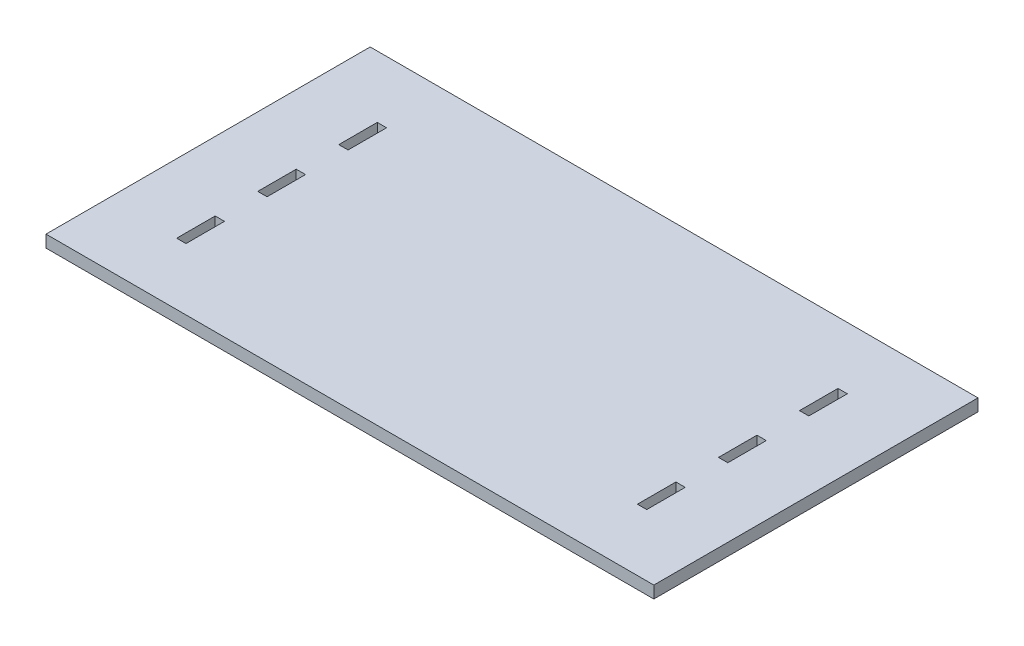
ISO-10303-21;
HEADER;
FILE_DESCRIPTION(('STEP AP214'),'2;1');
FILE_NAME('part.step','',(''),(''),'','','');
FILE_SCHEMA(('AUTOMOTIVE_DESIGN { 1 0 10303 214 1 1 1 1 }'));
ENDSEC;
DATA;
#1=APPLICATION_CONTEXT('core data for automotive mechanical design processes');
#2=APPLICATION_PROTOCOL_DEFINITION('international standard','automotive_design',2000,#1);
#3=PRODUCT_CONTEXT('',#1,'mechanical');
#4=PRODUCT('Part','Part','',(#3));
#5=PRODUCT_RELATED_PRODUCT_CATEGORY('part','',(#4));
#6=PRODUCT_DEFINITION_FORMATION('','',#4);
#7=PRODUCT_DEFINITION_CONTEXT('part definition',#1,'design');
#8=PRODUCT_DEFINITION('design','',#6,#7);
#9=PRODUCT_DEFINITION_SHAPE('','',#8);
#10=(LENGTH_UNIT() NAMED_UNIT(*) SI_UNIT(.MILLI.,.METRE.));
#11=(NAMED_UNIT(*) PLANE_ANGLE_UNIT() SI_UNIT($,.RADIAN.));
#12=(NAMED_UNIT(*) SI_UNIT($,.STERADIAN.) SOLID_ANGLE_UNIT());
#13=UNCERTAINTY_MEASURE_WITH_UNIT(LENGTH_MEASURE(1.E-05),#10,'distance_accuracy_value','');
#14=(GEOMETRIC_REPRESENTATION_CONTEXT(3) GLOBAL_UNCERTAINTY_ASSIGNED_CONTEXT((#13)) GLOBAL_UNIT_ASSIGNED_CONTEXT((#10,
#11,#12)) REPRESENTATION_CONTEXT('',''));
#15=CARTESIAN_POINT('',(0.,0.,0.));
#16=DIRECTION('',(0.,0.,1.));
#17=DIRECTION('',(1.,0.,0.));
#18=AXIS2_PLACEMENT_3D('',#15,#16,#17);
#19=CARTESIAN_POINT('',(0.,3.,0.));
#20=DIRECTION('',(0.,-1.,0.));
#21=DIRECTION('',(0.,0.,-1.));
#22=AXIS2_PLACEMENT_3D('',#19,#20,#21);
#23=PLANE('',#22);
#24=DIRECTION('',(0.,0.,-1.));
#25=VECTOR('',#24,1.);
#26=CARTESIAN_POINT('',(-55.7,3.,15.25));
#27=LINE('',#26,#25);
#28=CARTESIAN_POINT('',(-55.7,3.,24.75));
#29=VERTEX_POINT('',#28);
#30=CARTESIAN_POINT('',(-55.7,3.,15.25));
#31=VERTEX_POINT('',#30);
#32=EDGE_CURVE('E277',#29,#31,#27,.T.);
#33=ORIENTED_EDGE('',*,*,#32,.F.);
#34=DIRECTION('',(1.,0.,0.));
#35=VECTOR('',#34,1.);
#36=CARTESIAN_POINT('',(-55.7,3.,24.75));
#37=LINE('',#36,#35);
#38=CARTESIAN_POINT('',(-58.,3.,24.7500000000001));
#39=VERTEX_POINT('',#38);
#40=EDGE_CURVE('E288',#39,#29,#37,.T.);
#41=ORIENTED_EDGE('',*,*,#40,.F.);
#42=DIRECTION('',(0.,0.,1.));
#43=VECTOR('',#42,1.);
#44=CARTESIAN_POINT('',(-58.,3.,15.25));
#45=LINE('',#44,#43);
#46=CARTESIAN_POINT('',(-58.,3.,15.25));
#47=VERTEX_POINT('',#46);
#48=EDGE_CURVE('E284',#47,#39,#45,.T.);
#49=ORIENTED_EDGE('',*,*,#48,.F.);
#50=DIRECTION('',(-1.,0.,0.));
#51=VECTOR('',#50,1.);
#52=CARTESIAN_POINT('',(-55.7,3.,15.25));
#53=LINE('',#52,#51);
#54=EDGE_CURVE('E280',#31,#47,#53,.T.);
#55=ORIENTED_EDGE('',*,*,#54,.F.);
#56=EDGE_LOOP('',(#33,#41,#49,#55));
#57=FACE_BOUND('',#56,.T.);
#58=DIRECTION('',(0.,0.,1.));
#59=VECTOR('',#58,1.);
#60=CARTESIAN_POINT('',(55.7,3.,15.25));
#61=LINE('',#60,#59);
#62=CARTESIAN_POINT('',(55.7,3.,15.25));
#63=VERTEX_POINT('',#62);
#64=CARTESIAN_POINT('',(55.7,3.,24.75));
#65=VERTEX_POINT('',#64);
#66=EDGE_CURVE('E363',#63,#65,#61,.T.);
#67=ORIENTED_EDGE('',*,*,#66,.F.);
#68=DIRECTION('',(-1.,0.,0.));
#69=VECTOR('',#68,1.);
#70=CARTESIAN_POINT('',(55.7,3.,15.25));
#71=LINE('',#70,#69);
#72=CARTESIAN_POINT('',(58.,3.,15.25));
#73=VERTEX_POINT('',#72);
#74=EDGE_CURVE('E374',#73,#63,#71,.T.);
#75=ORIENTED_EDGE('',*,*,#74,.F.);
#76=DIRECTION('',(0.,0.,-1.));
#77=VECTOR('',#76,1.);
#78=CARTESIAN_POINT('',(58.,3.,15.25));
#79=LINE('',#78,#77);
#80=CARTESIAN_POINT('',(58.,3.,24.75));
#81=VERTEX_POINT('',#80);
#82=EDGE_CURVE('E370',#81,#73,#79,.T.);
#83=ORIENTED_EDGE('',*,*,#82,.F.);
#84=DIRECTION('',(1.,0.,0.));
#85=VECTOR('',#84,1.);
#86=CARTESIAN_POINT('',(55.7,3.,24.75));
#87=LINE('',#86,#85);
#88=EDGE_CURVE('E366',#65,#81,#87,.T.);
#89=ORIENTED_EDGE('',*,*,#88,.F.);
#90=EDGE_LOOP('',(#67,#75,#83,#89));
#91=FACE_BOUND('',#90,.T.);
#92=DIRECTION('',(0.,0.,1.));
#93=VECTOR('',#92,1.);
#94=CARTESIAN_POINT('',(55.7,3.,-24.75));
#95=LINE('',#94,#93);
#96=CARTESIAN_POINT('',(55.7,3.,-24.75));
#97=VERTEX_POINT('',#96);
#98=CARTESIAN_POINT('',(55.7,3.,-15.25));
#99=VERTEX_POINT('',#98);
#100=EDGE_CURVE('E449',#97,#99,#95,.T.);
#101=ORIENTED_EDGE('',*,*,#100,.F.);
#102=DIRECTION('',(-1.,0.,0.));
#103=VECTOR('',#102,1.);
#104=CARTESIAN_POINT('',(55.7,3.,-24.75));
#105=LINE('',#104,#103);
#106=CARTESIAN_POINT('',(58.,3.,-24.75));
#107=VERTEX_POINT('',#106);
#108=EDGE_CURVE('E460',#107,#97,#105,.T.);
#109=ORIENTED_EDGE('',*,*,#108,.F.);
#110=DIRECTION('',(0.,0.,-1.));
#111=VECTOR('',#110,1.);
#112=CARTESIAN_POINT('',(58.,3.,-24.75));
#113=LINE('',#112,#111);
#114=CARTESIAN_POINT('',(58.,3.,-15.25));
#115=VERTEX_POINT('',#114);
#116=EDGE_CURVE('E456',#115,#107,#113,.T.);
#117=ORIENTED_EDGE('',*,*,#116,.F.);
#118=DIRECTION('',(1.,0.,0.));
#119=VECTOR('',#118,1.);
#120=CARTESIAN_POINT('',(55.7,3.,-15.25));
#121=LINE('',#120,#119);
#122=EDGE_CURVE('E452',#99,#115,#121,.T.);
#123=ORIENTED_EDGE('',*,*,#122,.F.);
#124=EDGE_LOOP('',(#101,#109,#117,#123));
#125=FACE_BOUND('',#124,.T.);
#126=DIRECTION('',(0.,0.,-1.));
#127=VECTOR('',#126,1.);
#128=CARTESIAN_POINT('',(75.,3.,40.));
#129=LINE('',#128,#127);
#130=CARTESIAN_POINT('',(75.,3.,40.));
#131=VERTEX_POINT('',#130);
#132=CARTESIAN_POINT('',(75.,3.,-40.));
#133=VERTEX_POINT('',#132);
#134=EDGE_CURVE('E492',#131,#133,#129,.T.);
#135=ORIENTED_EDGE('',*,*,#134,.T.);
#136=DIRECTION('',(-1.,0.,0.));
#137=VECTOR('',#136,1.);
#138=CARTESIAN_POINT('',(-75.,3.,-40.));
#139=LINE('',#138,#137);
#140=CARTESIAN_POINT('',(-75.,3.,-40.));
#141=VERTEX_POINT('',#140);
#142=EDGE_CURVE('E496',#133,#141,#139,.T.);
#143=ORIENTED_EDGE('',*,*,#142,.T.);
#144=DIRECTION('',(0.,0.,1.));
#145=VECTOR('',#144,1.);
#146=CARTESIAN_POINT('',(-75.,3.,40.));
#147=LINE('',#146,#145);
#148=CARTESIAN_POINT('',(-75.,3.,40.));
#149=VERTEX_POINT('',#148);
#150=EDGE_CURVE('E500',#141,#149,#147,.T.);
#151=ORIENTED_EDGE('',*,*,#150,.T.);
#152=DIRECTION('',(1.,0.,0.));
#153=VECTOR('',#152,1.);
#154=CARTESIAN_POINT('',(-75.,3.,40.));
#155=LINE('',#154,#153);
#156=EDGE_CURVE('E503',#149,#131,#155,.T.);
#157=ORIENTED_EDGE('',*,*,#156,.T.);
#158=EDGE_LOOP('',(#135,#143,#151,#157));
#159=FACE_BOUND('',#158,.T.);
#160=DIRECTION('',(0.,0.,1.));
#161=VECTOR('',#160,1.);
#162=CARTESIAN_POINT('',(55.7,3.,-4.74999999999998));
#163=LINE('',#162,#161);
#164=CARTESIAN_POINT('',(55.7,3.,-4.74999999999998));
#165=VERTEX_POINT('',#164);
#166=CARTESIAN_POINT('',(55.7,3.,4.75000000000001));
#167=VERTEX_POINT('',#166);
#168=EDGE_CURVE('E406',#165,#167,#163,.T.);
#169=ORIENTED_EDGE('',*,*,#168,.F.);
#170=DIRECTION('',(-1.,0.,0.));
#171=VECTOR('',#170,1.);
#172=CARTESIAN_POINT('',(55.7,3.,-4.74999999999998));
#173=LINE('',#172,#171);
#174=CARTESIAN_POINT('',(58.,3.,-4.74999999999998));
#175=VERTEX_POINT('',#174);
#176=EDGE_CURVE('E417',#175,#165,#173,.T.);
#177=ORIENTED_EDGE('',*,*,#176,.F.);
#178=DIRECTION('',(0.,0.,-1.));
#179=VECTOR('',#178,1.);
#180=CARTESIAN_POINT('',(58.,3.,-4.74999999999998));
#181=LINE('',#180,#179);
#182=CARTESIAN_POINT('',(58.,3.,4.75000000000001));
#183=VERTEX_POINT('',#182);
#184=EDGE_CURVE('E413',#183,#175,#181,.T.);
#185=ORIENTED_EDGE('',*,*,#184,.F.);
#186=DIRECTION('',(1.,0.,0.));
#187=VECTOR('',#186,1.);
#188=CARTESIAN_POINT('',(55.7,3.,4.75000000000001));
#189=LINE('',#188,#187);
#190=EDGE_CURVE('E409',#167,#183,#189,.T.);
#191=ORIENTED_EDGE('',*,*,#190,.F.);
#192=EDGE_LOOP('',(#169,#177,#185,#191));
#193=FACE_BOUND('',#192,.T.);
#194=DIRECTION('',(0.,0.,-1.));
#195=VECTOR('',#194,1.);
#196=CARTESIAN_POINT('',(-55.7,3.,-24.75));
#197=LINE('',#196,#195);
#198=CARTESIAN_POINT('',(-55.7,3.,-15.25));
#199=VERTEX_POINT('',#198);
#200=CARTESIAN_POINT('',(-55.7,3.,-24.75));
#201=VERTEX_POINT('',#200);
#202=EDGE_CURVE('E320',#199,#201,#197,.T.);
#203=ORIENTED_EDGE('',*,*,#202,.F.);
#204=DIRECTION('',(1.,0.,0.));
#205=VECTOR('',#204,1.);
#206=CARTESIAN_POINT('',(-55.7,3.,-15.25));
#207=LINE('',#206,#205);
#208=CARTESIAN_POINT('',(-58.,3.,-15.25));
#209=VERTEX_POINT('',#208);
#210=EDGE_CURVE('E331',#209,#199,#207,.T.);
#211=ORIENTED_EDGE('',*,*,#210,.F.);
#212=DIRECTION('',(0.,0.,1.));
#213=VECTOR('',#212,1.);
#214=CARTESIAN_POINT('',(-58.,3.,-24.75));
#215=LINE('',#214,#213);
#216=CARTESIAN_POINT('',(-58.,3.,-24.75));
#217=VERTEX_POINT('',#216);
#218=EDGE_CURVE('E327',#217,#209,#215,.T.);
#219=ORIENTED_EDGE('',*,*,#218,.F.);
#220=DIRECTION('',(-1.,0.,0.));
#221=VECTOR('',#220,1.);
#222=CARTESIAN_POINT('',(-55.7,3.,-24.75));
#223=LINE('',#222,#221);
#224=EDGE_CURVE('E323',#201,#217,#223,.T.);
#225=ORIENTED_EDGE('',*,*,#224,.F.);
#226=EDGE_LOOP('',(#203,#211,#219,#225));
#227=FACE_BOUND('',#226,.T.);
#228=DIRECTION('',(0.,0.,-1.));
#229=VECTOR('',#228,1.);
#230=CARTESIAN_POINT('',(-55.7,3.,-4.74999999999995));
#231=LINE('',#230,#229);
#232=CARTESIAN_POINT('',(-55.7,3.,4.75000000000005));
#233=VERTEX_POINT('',#232);
#234=CARTESIAN_POINT('',(-55.7,3.,-4.74999999999995));
#235=VERTEX_POINT('',#234);
#236=EDGE_CURVE('E229',#233,#235,#231,.T.);
#237=ORIENTED_EDGE('',*,*,#236,.F.);
#238=DIRECTION('',(1.,0.,0.));
#239=VECTOR('',#238,1.);
#240=CARTESIAN_POINT('',(-55.7,3.,4.75000000000005));
#241=LINE('',#240,#239);
#242=CARTESIAN_POINT('',(-58.,3.,4.75000000000005));
#243=VERTEX_POINT('',#242);
#244=EDGE_CURVE('E255',#243,#233,#241,.T.);
#245=ORIENTED_EDGE('',*,*,#244,.F.);
#246=DIRECTION('',(0.,0.,1.));
#247=VECTOR('',#246,1.);
#248=CARTESIAN_POINT('',(-58.,3.,-4.74999999999995));
#249=LINE('',#248,#247);
#250=CARTESIAN_POINT('',(-58.,3.,-4.74999999999995));
#251=VERTEX_POINT('',#250);
#252=EDGE_CURVE('E251',#251,#243,#249,.T.);
#253=ORIENTED_EDGE('',*,*,#252,.F.);
#254=DIRECTION('',(-1.,0.,0.));
#255=VECTOR('',#254,1.);
#256=CARTESIAN_POINT('',(-55.7,3.,-4.74999999999995));
#257=LINE('',#256,#255);
#258=EDGE_CURVE('E238',#235,#251,#257,.T.);
#259=ORIENTED_EDGE('',*,*,#258,.F.);
#260=EDGE_LOOP('',(#237,#245,#253,#259));
#261=FACE_BOUND('',#260,.T.);
#262=ADVANCED_FACE('F43',(#57,#91,#125,#159,#193,#227,#261),#23,.F.);
#263=CARTESIAN_POINT('',(0.,0.,0.));
#264=DIRECTION('',(0.,-1.,0.));
#265=DIRECTION('',(0.,0.,-1.));
#266=AXIS2_PLACEMENT_3D('',#263,#264,#265);
#267=PLANE('',#266);
#268=DIRECTION('',(0.,0.,-1.));
#269=VECTOR('',#268,1.);
#270=CARTESIAN_POINT('',(75.,0.,40.));
#271=LINE('',#270,#269);
#272=CARTESIAN_POINT('',(75.,0.,40.));
#273=VERTEX_POINT('',#272);
#274=CARTESIAN_POINT('',(75.,0.,-40.));
#275=VERTEX_POINT('',#274);
#276=EDGE_CURVE('E491',#273,#275,#271,.T.);
#277=ORIENTED_EDGE('',*,*,#276,.F.);
#278=DIRECTION('',(1.,0.,0.));
#279=VECTOR('',#278,1.);
#280=CARTESIAN_POINT('',(-75.,0.,40.));
#281=LINE('',#280,#279);
#282=CARTESIAN_POINT('',(-75.,0.,40.));
#283=VERTEX_POINT('',#282);
#284=EDGE_CURVE('E497',#283,#273,#281,.T.);
#285=ORIENTED_EDGE('',*,*,#284,.F.);
#286=DIRECTION('',(0.,0.,1.));
#287=VECTOR('',#286,1.);
#288=CARTESIAN_POINT('',(-75.,0.,40.));
#289=LINE('',#288,#287);
#290=CARTESIAN_POINT('',(-75.,0.,-40.));
#291=VERTEX_POINT('',#290);
#292=EDGE_CURVE('E513',#291,#283,#289,.T.);
#293=ORIENTED_EDGE('',*,*,#292,.F.);
#294=DIRECTION('',(-1.,0.,0.));
#295=VECTOR('',#294,1.);
#296=CARTESIAN_POINT('',(-75.,0.,-40.));
#297=LINE('',#296,#295);
#298=EDGE_CURVE('E510',#275,#291,#297,.T.);
#299=ORIENTED_EDGE('',*,*,#298,.F.);
#300=EDGE_LOOP('',(#277,#285,#293,#299));
#301=FACE_BOUND('',#300,.T.);
#302=DIRECTION('',(-1.,0.,0.));
#303=VECTOR('',#302,1.);
#304=CARTESIAN_POINT('',(55.7,0.,-24.75));
#305=LINE('',#304,#303);
#306=CARTESIAN_POINT('',(58.,0.,-24.75));
#307=VERTEX_POINT('',#306);
#308=CARTESIAN_POINT('',(55.7,0.,-24.75));
#309=VERTEX_POINT('',#308);
#310=EDGE_CURVE('E453',#307,#309,#305,.T.);
#311=ORIENTED_EDGE('',*,*,#310,.T.);
#312=DIRECTION('',(0.,0.,1.));
#313=VECTOR('',#312,1.);
#314=CARTESIAN_POINT('',(55.7,0.,-24.75));
#315=LINE('',#314,#313);
#316=CARTESIAN_POINT('',(55.7,0.,-15.25));
#317=VERTEX_POINT('',#316);
#318=EDGE_CURVE('E448',#309,#317,#315,.T.);
#319=ORIENTED_EDGE('',*,*,#318,.T.);
#320=DIRECTION('',(1.,0.,0.));
#321=VECTOR('',#320,1.);
#322=CARTESIAN_POINT('',(55.7,0.,-15.25));
#323=LINE('',#322,#321);
#324=CARTESIAN_POINT('',(58.,0.,-15.25));
#325=VERTEX_POINT('',#324);
#326=EDGE_CURVE('E467',#317,#325,#323,.T.);
#327=ORIENTED_EDGE('',*,*,#326,.T.);
#328=DIRECTION('',(0.,0.,-1.));
#329=VECTOR('',#328,1.);
#330=CARTESIAN_POINT('',(58.,0.,-24.75));
#331=LINE('',#330,#329);
#332=EDGE_CURVE('E471',#325,#307,#331,.T.);
#333=ORIENTED_EDGE('',*,*,#332,.T.);
#334=EDGE_LOOP('',(#311,#319,#327,#333));
#335=FACE_BOUND('',#334,.T.);
#336=DIRECTION('',(-1.,0.,0.));
#337=VECTOR('',#336,1.);
#338=CARTESIAN_POINT('',(55.7,0.,-4.74999999999998));
#339=LINE('',#338,#337);
#340=CARTESIAN_POINT('',(58.,0.,-4.74999999999998));
#341=VERTEX_POINT('',#340);
#342=CARTESIAN_POINT('',(55.7,0.,-4.74999999999998));
#343=VERTEX_POINT('',#342);
#344=EDGE_CURVE('E410',#341,#343,#339,.T.);
#345=ORIENTED_EDGE('',*,*,#344,.T.);
#346=DIRECTION('',(0.,0.,1.));
#347=VECTOR('',#346,1.);
#348=CARTESIAN_POINT('',(55.7,0.,-4.74999999999998));
#349=LINE('',#348,#347);
#350=CARTESIAN_POINT('',(55.7,0.,4.75000000000001));
#351=VERTEX_POINT('',#350);
#352=EDGE_CURVE('E405',#343,#351,#349,.T.);
#353=ORIENTED_EDGE('',*,*,#352,.T.);
#354=DIRECTION('',(1.,0.,0.));
#355=VECTOR('',#354,1.);
#356=CARTESIAN_POINT('',(55.7,0.,4.75000000000001));
#357=LINE('',#356,#355);
#358=CARTESIAN_POINT('',(58.,0.,4.75000000000001));
#359=VERTEX_POINT('',#358);
#360=EDGE_CURVE('E424',#351,#359,#357,.T.);
#361=ORIENTED_EDGE('',*,*,#360,.T.);
#362=DIRECTION('',(0.,0.,-1.));
#363=VECTOR('',#362,1.);
#364=CARTESIAN_POINT('',(58.,0.,-4.74999999999998));
#365=LINE('',#364,#363);
#366=EDGE_CURVE('E428',#359,#341,#365,.T.);
#367=ORIENTED_EDGE('',*,*,#366,.T.);
#368=EDGE_LOOP('',(#345,#353,#361,#367));
#369=FACE_BOUND('',#368,.T.);
#370=DIRECTION('',(-1.,0.,0.));
#371=VECTOR('',#370,1.);
#372=CARTESIAN_POINT('',(55.7,0.,15.25));
#373=LINE('',#372,#371);
#374=CARTESIAN_POINT('',(58.,0.,15.25));
#375=VERTEX_POINT('',#374);
#376=CARTESIAN_POINT('',(55.7,0.,15.25));
#377=VERTEX_POINT('',#376);
#378=EDGE_CURVE('E367',#375,#377,#373,.T.);
#379=ORIENTED_EDGE('',*,*,#378,.T.);
#380=DIRECTION('',(0.,0.,1.));
#381=VECTOR('',#380,1.);
#382=CARTESIAN_POINT('',(55.7,0.,15.25));
#383=LINE('',#382,#381);
#384=CARTESIAN_POINT('',(55.7,0.,24.75));
#385=VERTEX_POINT('',#384);
#386=EDGE_CURVE('E362',#377,#385,#383,.T.);
#387=ORIENTED_EDGE('',*,*,#386,.T.);
#388=DIRECTION('',(1.,0.,0.));
#389=VECTOR('',#388,1.);
#390=CARTESIAN_POINT('',(55.7,0.,24.75));
#391=LINE('',#390,#389);
#392=CARTESIAN_POINT('',(58.,0.,24.75));
#393=VERTEX_POINT('',#392);
#394=EDGE_CURVE('E381',#385,#393,#391,.T.);
#395=ORIENTED_EDGE('',*,*,#394,.T.);
#396=DIRECTION('',(0.,0.,-1.));
#397=VECTOR('',#396,1.);
#398=CARTESIAN_POINT('',(58.,0.,15.25));
#399=LINE('',#398,#397);
#400=EDGE_CURVE('E385',#393,#375,#399,.T.);
#401=ORIENTED_EDGE('',*,*,#400,.T.);
#402=EDGE_LOOP('',(#379,#387,#395,#401));
#403=FACE_BOUND('',#402,.T.);
#404=DIRECTION('',(1.,0.,0.));
#405=VECTOR('',#404,1.);
#406=CARTESIAN_POINT('',(-55.7,0.,-15.25));
#407=LINE('',#406,#405);
#408=CARTESIAN_POINT('',(-58.,0.,-15.25));
#409=VERTEX_POINT('',#408);
#410=CARTESIAN_POINT('',(-55.7,0.,-15.25));
#411=VERTEX_POINT('',#410);
#412=EDGE_CURVE('E324',#409,#411,#407,.T.);
#413=ORIENTED_EDGE('',*,*,#412,.T.);
#414=DIRECTION('',(0.,0.,-1.));
#415=VECTOR('',#414,1.);
#416=CARTESIAN_POINT('',(-55.7,0.,-24.75));
#417=LINE('',#416,#415);
#418=CARTESIAN_POINT('',(-55.7,0.,-24.75));
#419=VERTEX_POINT('',#418);
#420=EDGE_CURVE('E319',#411,#419,#417,.T.);
#421=ORIENTED_EDGE('',*,*,#420,.T.);
#422=DIRECTION('',(-1.,0.,0.));
#423=VECTOR('',#422,1.);
#424=CARTESIAN_POINT('',(-55.7,0.,-24.75));
#425=LINE('',#424,#423);
#426=CARTESIAN_POINT('',(-58.,0.,-24.75));
#427=VERTEX_POINT('',#426);
#428=EDGE_CURVE('E338',#419,#427,#425,.T.);
#429=ORIENTED_EDGE('',*,*,#428,.T.);
#430=DIRECTION('',(0.,0.,1.));
#431=VECTOR('',#430,1.);
#432=CARTESIAN_POINT('',(-58.,0.,-24.75));
#433=LINE('',#432,#431);
#434=EDGE_CURVE('E342',#427,#409,#433,.T.);
#435=ORIENTED_EDGE('',*,*,#434,.T.);
#436=EDGE_LOOP('',(#413,#421,#429,#435));
#437=FACE_BOUND('',#436,.T.);
#438=DIRECTION('',(1.,0.,0.));
#439=VECTOR('',#438,1.);
#440=CARTESIAN_POINT('',(-55.7,0.,24.75));
#441=LINE('',#440,#439);
#442=CARTESIAN_POINT('',(-58.,0.,24.7500000000001));
#443=VERTEX_POINT('',#442);
#444=CARTESIAN_POINT('',(-55.7,0.,24.75));
#445=VERTEX_POINT('',#444);
#446=EDGE_CURVE('E281',#443,#445,#441,.T.);
#447=ORIENTED_EDGE('',*,*,#446,.T.);
#448=DIRECTION('',(0.,0.,-1.));
#449=VECTOR('',#448,1.);
#450=CARTESIAN_POINT('',(-55.7,0.,15.25));
#451=LINE('',#450,#449);
#452=CARTESIAN_POINT('',(-55.7,0.,15.25));
#453=VERTEX_POINT('',#452);
#454=EDGE_CURVE('E247',#445,#453,#451,.T.);
#455=ORIENTED_EDGE('',*,*,#454,.T.);
#456=DIRECTION('',(-1.,0.,0.));
#457=VECTOR('',#456,1.);
#458=CARTESIAN_POINT('',(-55.7,0.,15.25));
#459=LINE('',#458,#457);
#460=CARTESIAN_POINT('',(-58.,0.,15.25));
#461=VERTEX_POINT('',#460);
#462=EDGE_CURVE('E295',#453,#461,#459,.T.);
#463=ORIENTED_EDGE('',*,*,#462,.T.);
#464=DIRECTION('',(0.,0.,1.));
#465=VECTOR('',#464,1.);
#466=CARTESIAN_POINT('',(-58.,0.,15.25));
#467=LINE('',#466,#465);
#468=EDGE_CURVE('E299',#461,#443,#467,.T.);
#469=ORIENTED_EDGE('',*,*,#468,.T.);
#470=EDGE_LOOP('',(#447,#455,#463,#469));
#471=FACE_BOUND('',#470,.T.);
#472=DIRECTION('',(1.,0.,0.));
#473=VECTOR('',#472,1.);
#474=CARTESIAN_POINT('',(-55.7,0.,4.75000000000005));
#475=LINE('',#474,#473);
#476=CARTESIAN_POINT('',(-58.,0.,4.75000000000005));
#477=VERTEX_POINT('',#476);
#478=CARTESIAN_POINT('',(-55.7,0.,4.75000000000005));
#479=VERTEX_POINT('',#478);
#480=EDGE_CURVE('E239',#477,#479,#475,.T.);
#481=ORIENTED_EDGE('',*,*,#480,.T.);
#482=DIRECTION('',(0.,0.,-1.));
#483=VECTOR('',#482,1.);
#484=CARTESIAN_POINT('',(-55.7,0.,-4.74999999999995));
#485=LINE('',#484,#483);
#486=CARTESIAN_POINT('',(-55.7,0.,-4.74999999999995));
#487=VERTEX_POINT('',#486);
#488=EDGE_CURVE('E67',#479,#487,#485,.T.);
#489=ORIENTED_EDGE('',*,*,#488,.T.);
#490=DIRECTION('',(-1.,0.,0.));
#491=VECTOR('',#490,1.);
#492=CARTESIAN_POINT('',(-55.7,0.,-4.74999999999995));
#493=LINE('',#492,#491);
#494=CARTESIAN_POINT('',(-58.,0.,-4.74999999999995));
#495=VERTEX_POINT('',#494);
#496=EDGE_CURVE('E245',#487,#495,#493,.T.);
#497=ORIENTED_EDGE('',*,*,#496,.T.);
#498=DIRECTION('',(0.,0.,1.));
#499=VECTOR('',#498,1.);
#500=CARTESIAN_POINT('',(-58.,0.,-4.74999999999995));
#501=LINE('',#500,#499);
#502=EDGE_CURVE('E264',#495,#477,#501,.T.);
#503=ORIENTED_EDGE('',*,*,#502,.T.);
#504=EDGE_LOOP('',(#481,#489,#497,#503));
#505=FACE_BOUND('',#504,.T.);
#506=ADVANCED_FACE('F536',(#301,#335,#369,#403,#437,#471,#505),#267,.T.);
#507=CARTESIAN_POINT('',(75.,3.,40.));
#508=DIRECTION('',(-1.,0.,0.));
#509=DIRECTION('',(0.,0.,1.));
#510=AXIS2_PLACEMENT_3D('',#507,#508,#509);
#511=PLANE('',#510);
#512=ORIENTED_EDGE('',*,*,#276,.T.);
#513=DIRECTION('',(0.,-1.,0.));
#514=VECTOR('',#513,1.);
#515=CARTESIAN_POINT('',(75.,3.,-40.));
#516=LINE('',#515,#514);
#517=EDGE_CURVE('E11',#133,#275,#516,.T.);
#518=ORIENTED_EDGE('',*,*,#517,.F.);
#519=ORIENTED_EDGE('',*,*,#134,.F.);
#520=DIRECTION('',(0.,-1.,0.));
#521=VECTOR('',#520,1.);
#522=CARTESIAN_POINT('',(75.,3.,40.));
#523=LINE('',#522,#521);
#524=EDGE_CURVE('E506',#131,#273,#523,.T.);
#525=ORIENTED_EDGE('',*,*,#524,.T.);
#526=EDGE_LOOP('',(#512,#518,#519,#525));
#527=FACE_BOUND('',#526,.T.);
#528=ADVANCED_FACE('F45',(#527),#511,.F.);
#529=CARTESIAN_POINT('',(-75.,3.,-40.));
#530=DIRECTION('',(0.,0.,1.));
#531=DIRECTION('',(1.,0.,0.));
#532=AXIS2_PLACEMENT_3D('',#529,#530,#531);
#533=PLANE('',#532);
#534=ORIENTED_EDGE('',*,*,#298,.T.);
#535=DIRECTION('',(0.,-1.,0.));
#536=VECTOR('',#535,1.);
#537=CARTESIAN_POINT('',(-75.,3.,-40.));
#538=LINE('',#537,#536);
#539=EDGE_CURVE('E52',#141,#291,#538,.T.);
#540=ORIENTED_EDGE('',*,*,#539,.F.);
#541=ORIENTED_EDGE('',*,*,#142,.F.);
#542=ORIENTED_EDGE('',*,*,#517,.T.);
#543=EDGE_LOOP('',(#534,#540,#541,#542));
#544=FACE_BOUND('',#543,.T.);
#545=ADVANCED_FACE('F547',(#544),#533,.F.);
#546=CARTESIAN_POINT('',(-75.,3.,40.));
#547=DIRECTION('',(1.,0.,0.));
#548=DIRECTION('',(0.,0.,-1.));
#549=AXIS2_PLACEMENT_3D('',#546,#547,#548);
#550=PLANE('',#549);
#551=ORIENTED_EDGE('',*,*,#292,.T.);
#552=DIRECTION('',(0.,-1.,0.));
#553=VECTOR('',#552,1.);
#554=CARTESIAN_POINT('',(-75.,3.,40.));
#555=LINE('',#554,#553);
#556=EDGE_CURVE('E521',#149,#283,#555,.T.);
#557=ORIENTED_EDGE('',*,*,#556,.F.);
#558=ORIENTED_EDGE('',*,*,#150,.F.);
#559=ORIENTED_EDGE('',*,*,#539,.T.);
#560=EDGE_LOOP('',(#551,#557,#558,#559));
#561=FACE_BOUND('',#560,.T.);
#562=ADVANCED_FACE('F530',(#561),#550,.F.);
#563=CARTESIAN_POINT('',(-75.,3.,40.));
#564=DIRECTION('',(0.,0.,-1.));
#565=DIRECTION('',(-1.,0.,0.));
#566=AXIS2_PLACEMENT_3D('',#563,#564,#565);
#567=PLANE('',#566);
#568=ORIENTED_EDGE('',*,*,#284,.T.);
#569=ORIENTED_EDGE('',*,*,#524,.F.);
#570=ORIENTED_EDGE('',*,*,#156,.F.);
#571=ORIENTED_EDGE('',*,*,#556,.T.);
#572=EDGE_LOOP('',(#568,#569,#570,#571));
#573=FACE_BOUND('',#572,.T.);
#574=ADVANCED_FACE('F540',(#573),#567,.F.);
#575=CARTESIAN_POINT('',(55.7,3.,-24.75));
#576=DIRECTION('',(1.,0.,0.));
#577=DIRECTION('',(0.,0.,-1.));
#578=AXIS2_PLACEMENT_3D('',#575,#576,#577);
#579=PLANE('',#578);
#580=ORIENTED_EDGE('',*,*,#318,.F.);
#581=DIRECTION('',(0.,-1.,0.));
#582=VECTOR('',#581,1.);
#583=CARTESIAN_POINT('',(55.7,3.,-24.75));
#584=LINE('',#583,#582);
#585=EDGE_CURVE('E463',#97,#309,#584,.T.);
#586=ORIENTED_EDGE('',*,*,#585,.F.);
#587=ORIENTED_EDGE('',*,*,#100,.T.);
#588=DIRECTION('',(0.,-1.,0.));
#589=VECTOR('',#588,1.);
#590=CARTESIAN_POINT('',(55.7,3.,-15.25));
#591=LINE('',#590,#589);
#592=EDGE_CURVE('E487',#99,#317,#591,.T.);
#593=ORIENTED_EDGE('',*,*,#592,.T.);
#594=EDGE_LOOP('',(#580,#586,#587,#593));
#595=FACE_BOUND('',#594,.T.);
#596=ADVANCED_FACE('F564',(#595),#579,.T.);
#597=CARTESIAN_POINT('',(55.7,3.,-15.25));
#598=DIRECTION('',(0.,0.,-1.));
#599=DIRECTION('',(-1.,0.,0.));
#600=AXIS2_PLACEMENT_3D('',#597,#598,#599);
#601=PLANE('',#600);
#602=ORIENTED_EDGE('',*,*,#326,.F.);
#603=ORIENTED_EDGE('',*,*,#592,.F.);
#604=ORIENTED_EDGE('',*,*,#122,.T.);
#605=DIRECTION('',(0.,-1.,0.));
#606=VECTOR('',#605,1.);
#607=CARTESIAN_POINT('',(58.,3.,-15.25));
#608=LINE('',#607,#606);
#609=EDGE_CURVE('E484',#115,#325,#608,.T.);
#610=ORIENTED_EDGE('',*,*,#609,.T.);
#611=EDGE_LOOP('',(#602,#603,#604,#610));
#612=FACE_BOUND('',#611,.T.);
#613=ADVANCED_FACE('F571',(#612),#601,.T.);
#614=CARTESIAN_POINT('',(58.,3.,-24.75));
#615=DIRECTION('',(-1.,0.,0.));
#616=DIRECTION('',(0.,0.,1.));
#617=AXIS2_PLACEMENT_3D('',#614,#615,#616);
#618=PLANE('',#617);
#619=ORIENTED_EDGE('',*,*,#332,.F.);
#620=ORIENTED_EDGE('',*,*,#609,.F.);
#621=ORIENTED_EDGE('',*,*,#116,.T.);
#622=DIRECTION('',(0.,-1.,0.));
#623=VECTOR('',#622,1.);
#624=CARTESIAN_POINT('',(58.,3.,-24.75));
#625=LINE('',#624,#623);
#626=EDGE_CURVE('E481',#107,#307,#625,.T.);
#627=ORIENTED_EDGE('',*,*,#626,.T.);
#628=EDGE_LOOP('',(#619,#620,#621,#627));
#629=FACE_BOUND('',#628,.T.);
#630=ADVANCED_FACE('F576',(#629),#618,.T.);
#631=CARTESIAN_POINT('',(55.7,3.,-24.75));
#632=DIRECTION('',(0.,0.,1.));
#633=DIRECTION('',(1.,0.,0.));
#634=AXIS2_PLACEMENT_3D('',#631,#632,#633);
#635=PLANE('',#634);
#636=ORIENTED_EDGE('',*,*,#310,.F.);
#637=ORIENTED_EDGE('',*,*,#626,.F.);
#638=ORIENTED_EDGE('',*,*,#108,.T.);
#639=ORIENTED_EDGE('',*,*,#585,.T.);
#640=EDGE_LOOP('',(#636,#637,#638,#639));
#641=FACE_BOUND('',#640,.T.);
#642=ADVANCED_FACE('F583',(#641),#635,.T.);
#643=CARTESIAN_POINT('',(55.7,3.,-4.74999999999998));
#644=DIRECTION('',(1.,0.,0.));
#645=DIRECTION('',(0.,0.,-1.));
#646=AXIS2_PLACEMENT_3D('',#643,#644,#645);
#647=PLANE('',#646);
#648=ORIENTED_EDGE('',*,*,#352,.F.);
#649=DIRECTION('',(0.,-1.,0.));
#650=VECTOR('',#649,1.);
#651=CARTESIAN_POINT('',(55.7,3.,-4.74999999999998));
#652=LINE('',#651,#650);
#653=EDGE_CURVE('E420',#165,#343,#652,.T.);
#654=ORIENTED_EDGE('',*,*,#653,.F.);
#655=ORIENTED_EDGE('',*,*,#168,.T.);
#656=DIRECTION('',(0.,-1.,0.));
#657=VECTOR('',#656,1.);
#658=CARTESIAN_POINT('',(55.7,3.,4.75000000000001));
#659=LINE('',#658,#657);
#660=EDGE_CURVE('E444',#167,#351,#659,.T.);
#661=ORIENTED_EDGE('',*,*,#660,.T.);
#662=EDGE_LOOP('',(#648,#654,#655,#661));
#663=FACE_BOUND('',#662,.T.);
#664=ADVANCED_FACE('F597',(#663),#647,.T.);
#665=CARTESIAN_POINT('',(55.7,3.,4.75000000000001));
#666=DIRECTION('',(0.,0.,-1.));
#667=DIRECTION('',(-1.,0.,0.));
#668=AXIS2_PLACEMENT_3D('',#665,#666,#667);
#669=PLANE('',#668);
#670=ORIENTED_EDGE('',*,*,#360,.F.);
#671=ORIENTED_EDGE('',*,*,#660,.F.);
#672=ORIENTED_EDGE('',*,*,#190,.T.);
#673=DIRECTION('',(0.,-1.,0.));
#674=VECTOR('',#673,1.);
#675=CARTESIAN_POINT('',(58.,3.,4.75000000000001));
#676=LINE('',#675,#674);
#677=EDGE_CURVE('E441',#183,#359,#676,.T.);
#678=ORIENTED_EDGE('',*,*,#677,.T.);
#679=EDGE_LOOP('',(#670,#671,#672,#678));
#680=FACE_BOUND('',#679,.T.);
#681=ADVANCED_FACE('F602',(#680),#669,.T.);
#682=CARTESIAN_POINT('',(58.,3.,-4.74999999999998));
#683=DIRECTION('',(-1.,0.,0.));
#684=DIRECTION('',(0.,0.,1.));
#685=AXIS2_PLACEMENT_3D('',#682,#683,#684);
#686=PLANE('',#685);
#687=ORIENTED_EDGE('',*,*,#366,.F.);
#688=ORIENTED_EDGE('',*,*,#677,.F.);
#689=ORIENTED_EDGE('',*,*,#184,.T.);
#690=DIRECTION('',(0.,-1.,0.));
#691=VECTOR('',#690,1.);
#692=CARTESIAN_POINT('',(58.,3.,-4.74999999999998));
#693=LINE('',#692,#691);
#694=EDGE_CURVE('E438',#175,#341,#693,.T.);
#695=ORIENTED_EDGE('',*,*,#694,.T.);
#696=EDGE_LOOP('',(#687,#688,#689,#695));
#697=FACE_BOUND('',#696,.T.);
#698=ADVANCED_FACE('F606',(#697),#686,.T.);
#699=CARTESIAN_POINT('',(55.7,3.,-4.74999999999998));
#700=DIRECTION('',(0.,0.,1.));
#701=DIRECTION('',(1.,0.,0.));
#702=AXIS2_PLACEMENT_3D('',#699,#700,#701);
#703=PLANE('',#702);
#704=ORIENTED_EDGE('',*,*,#344,.F.);
#705=ORIENTED_EDGE('',*,*,#694,.F.);
#706=ORIENTED_EDGE('',*,*,#176,.T.);
#707=ORIENTED_EDGE('',*,*,#653,.T.);
#708=EDGE_LOOP('',(#704,#705,#706,#707));
#709=FACE_BOUND('',#708,.T.);
#710=ADVANCED_FACE('F610',(#709),#703,.T.);
#711=CARTESIAN_POINT('',(55.7,3.,15.25));
#712=DIRECTION('',(1.,0.,0.));
#713=DIRECTION('',(0.,0.,-1.));
#714=AXIS2_PLACEMENT_3D('',#711,#712,#713);
#715=PLANE('',#714);
#716=ORIENTED_EDGE('',*,*,#386,.F.);
#717=DIRECTION('',(0.,-1.,0.));
#718=VECTOR('',#717,1.);
#719=CARTESIAN_POINT('',(55.7,3.,15.25));
#720=LINE('',#719,#718);
#721=EDGE_CURVE('E377',#63,#377,#720,.T.);
#722=ORIENTED_EDGE('',*,*,#721,.F.);
#723=ORIENTED_EDGE('',*,*,#66,.T.);
#724=DIRECTION('',(0.,-1.,0.));
#725=VECTOR('',#724,1.);
#726=CARTESIAN_POINT('',(55.7,3.,24.75));
#727=LINE('',#726,#725);
#728=EDGE_CURVE('E401',#65,#385,#727,.T.);
#729=ORIENTED_EDGE('',*,*,#728,.T.);
#730=EDGE_LOOP('',(#716,#722,#723,#729));
#731=FACE_BOUND('',#730,.T.);
#732=ADVANCED_FACE('F614',(#731),#715,.T.);
#733=CARTESIAN_POINT('',(55.7,3.,24.75));
#734=DIRECTION('',(0.,0.,-1.));
#735=DIRECTION('',(-1.,0.,0.));
#736=AXIS2_PLACEMENT_3D('',#733,#734,#735);
#737=PLANE('',#736);
#738=ORIENTED_EDGE('',*,*,#394,.F.);
#739=ORIENTED_EDGE('',*,*,#728,.F.);
#740=ORIENTED_EDGE('',*,*,#88,.T.);
#741=DIRECTION('',(0.,-1.,0.));
#742=VECTOR('',#741,1.);
#743=CARTESIAN_POINT('',(58.,3.,24.75));
#744=LINE('',#743,#742);
#745=EDGE_CURVE('E398',#81,#393,#744,.T.);
#746=ORIENTED_EDGE('',*,*,#745,.T.);
#747=EDGE_LOOP('',(#738,#739,#740,#746));
#748=FACE_BOUND('',#747,.T.);
#749=ADVANCED_FACE('F618',(#748),#737,.T.);
#750=CARTESIAN_POINT('',(58.,3.,15.25));
#751=DIRECTION('',(-1.,0.,0.));
#752=DIRECTION('',(0.,0.,1.));
#753=AXIS2_PLACEMENT_3D('',#750,#751,#752);
#754=PLANE('',#753);
#755=ORIENTED_EDGE('',*,*,#400,.F.);
#756=ORIENTED_EDGE('',*,*,#745,.F.);
#757=ORIENTED_EDGE('',*,*,#82,.T.);
#758=DIRECTION('',(0.,-1.,0.));
#759=VECTOR('',#758,1.);
#760=CARTESIAN_POINT('',(58.,3.,15.25));
#761=LINE('',#760,#759);
#762=EDGE_CURVE('E395',#73,#375,#761,.T.);
#763=ORIENTED_EDGE('',*,*,#762,.T.);
#764=EDGE_LOOP('',(#755,#756,#757,#763));
#765=FACE_BOUND('',#764,.T.);
#766=ADVANCED_FACE('F622',(#765),#754,.T.);
#767=CARTESIAN_POINT('',(55.7,3.,15.25));
#768=DIRECTION('',(0.,0.,1.));
#769=DIRECTION('',(1.,0.,0.));
#770=AXIS2_PLACEMENT_3D('',#767,#768,#769);
#771=PLANE('',#770);
#772=ORIENTED_EDGE('',*,*,#378,.F.);
#773=ORIENTED_EDGE('',*,*,#762,.F.);
#774=ORIENTED_EDGE('',*,*,#74,.T.);
#775=ORIENTED_EDGE('',*,*,#721,.T.);
#776=EDGE_LOOP('',(#772,#773,#774,#775));
#777=FACE_BOUND('',#776,.T.);
#778=ADVANCED_FACE('F626',(#777),#771,.T.);
#779=CARTESIAN_POINT('',(-55.7,3.,-24.75));
#780=DIRECTION('',(-1.,0.,0.));
#781=DIRECTION('',(0.,0.,1.));
#782=AXIS2_PLACEMENT_3D('',#779,#780,#781);
#783=PLANE('',#782);
#784=ORIENTED_EDGE('',*,*,#420,.F.);
#785=DIRECTION('',(0.,-1.,0.));
#786=VECTOR('',#785,1.);
#787=CARTESIAN_POINT('',(-55.7,3.,-15.25));
#788=LINE('',#787,#786);
#789=EDGE_CURVE('E334',#199,#411,#788,.T.);
#790=ORIENTED_EDGE('',*,*,#789,.F.);
#791=ORIENTED_EDGE('',*,*,#202,.T.);
#792=DIRECTION('',(0.,-1.,0.));
#793=VECTOR('',#792,1.);
#794=CARTESIAN_POINT('',(-55.7,3.,-24.75));
#795=LINE('',#794,#793);
#796=EDGE_CURVE('E358',#201,#419,#795,.T.);
#797=ORIENTED_EDGE('',*,*,#796,.T.);
#798=EDGE_LOOP('',(#784,#790,#791,#797));
#799=FACE_BOUND('',#798,.T.);
#800=ADVANCED_FACE('F630',(#799),#783,.T.);
#801=CARTESIAN_POINT('',(-55.7,3.,-24.75));
#802=DIRECTION('',(0.,0.,1.));
#803=DIRECTION('',(1.,0.,0.));
#804=AXIS2_PLACEMENT_3D('',#801,#802,#803);
#805=PLANE('',#804);
#806=ORIENTED_EDGE('',*,*,#428,.F.);
#807=ORIENTED_EDGE('',*,*,#796,.F.);
#808=ORIENTED_EDGE('',*,*,#224,.T.);
#809=DIRECTION('',(0.,-1.,0.));
#810=VECTOR('',#809,1.);
#811=CARTESIAN_POINT('',(-58.,3.,-24.75));
#812=LINE('',#811,#810);
#813=EDGE_CURVE('E355',#217,#427,#812,.T.);
#814=ORIENTED_EDGE('',*,*,#813,.T.);
#815=EDGE_LOOP('',(#806,#807,#808,#814));
#816=FACE_BOUND('',#815,.T.);
#817=ADVANCED_FACE('F634',(#816),#805,.T.);
#818=CARTESIAN_POINT('',(-58.,3.,-24.75));
#819=DIRECTION('',(1.,0.,0.));
#820=DIRECTION('',(0.,0.,-1.));
#821=AXIS2_PLACEMENT_3D('',#818,#819,#820);
#822=PLANE('',#821);
#823=ORIENTED_EDGE('',*,*,#434,.F.);
#824=ORIENTED_EDGE('',*,*,#813,.F.);
#825=ORIENTED_EDGE('',*,*,#218,.T.);
#826=DIRECTION('',(0.,-1.,0.));
#827=VECTOR('',#826,1.);
#828=CARTESIAN_POINT('',(-58.,3.,-15.25));
#829=LINE('',#828,#827);
#830=EDGE_CURVE('E352',#209,#409,#829,.T.);
#831=ORIENTED_EDGE('',*,*,#830,.T.);
#832=EDGE_LOOP('',(#823,#824,#825,#831));
#833=FACE_BOUND('',#832,.T.);
#834=ADVANCED_FACE('F638',(#833),#822,.T.);
#835=CARTESIAN_POINT('',(-55.7,3.,-15.25));
#836=DIRECTION('',(0.,0.,-1.));
#837=DIRECTION('',(-1.,0.,0.));
#838=AXIS2_PLACEMENT_3D('',#835,#836,#837);
#839=PLANE('',#838);
#840=ORIENTED_EDGE('',*,*,#412,.F.);
#841=ORIENTED_EDGE('',*,*,#830,.F.);
#842=ORIENTED_EDGE('',*,*,#210,.T.);
#843=ORIENTED_EDGE('',*,*,#789,.T.);
#844=EDGE_LOOP('',(#840,#841,#842,#843));
#845=FACE_BOUND('',#844,.T.);
#846=ADVANCED_FACE('F642',(#845),#839,.T.);
#847=CARTESIAN_POINT('',(-55.7,3.,15.25));
#848=DIRECTION('',(-1.,0.,0.));
#849=DIRECTION('',(0.,0.,1.));
#850=AXIS2_PLACEMENT_3D('',#847,#848,#849);
#851=PLANE('',#850);
#852=ORIENTED_EDGE('',*,*,#454,.F.);
#853=DIRECTION('',(0.,-1.,0.));
#854=VECTOR('',#853,1.);
#855=CARTESIAN_POINT('',(-55.7,3.,24.75));
#856=LINE('',#855,#854);
#857=EDGE_CURVE('E291',#29,#445,#856,.T.);
#858=ORIENTED_EDGE('',*,*,#857,.F.);
#859=ORIENTED_EDGE('',*,*,#32,.T.);
#860=DIRECTION('',(0.,-1.,0.));
#861=VECTOR('',#860,1.);
#862=CARTESIAN_POINT('',(-55.7,3.,15.25));
#863=LINE('',#862,#861);
#864=EDGE_CURVE('E315',#31,#453,#863,.T.);
#865=ORIENTED_EDGE('',*,*,#864,.T.);
#866=EDGE_LOOP('',(#852,#858,#859,#865));
#867=FACE_BOUND('',#866,.T.);
#868=ADVANCED_FACE('F646',(#867),#851,.T.);
#869=CARTESIAN_POINT('',(-55.7,3.,15.25));
#870=DIRECTION('',(0.,0.,1.));
#871=DIRECTION('',(1.,0.,0.));
#872=AXIS2_PLACEMENT_3D('',#869,#870,#871);
#873=PLANE('',#872);
#874=ORIENTED_EDGE('',*,*,#462,.F.);
#875=ORIENTED_EDGE('',*,*,#864,.F.);
#876=ORIENTED_EDGE('',*,*,#54,.T.);
#877=DIRECTION('',(0.,-1.,0.));
#878=VECTOR('',#877,1.);
#879=CARTESIAN_POINT('',(-58.,3.,15.25));
#880=LINE('',#879,#878);
#881=EDGE_CURVE('E312',#47,#461,#880,.T.);
#882=ORIENTED_EDGE('',*,*,#881,.T.);
#883=EDGE_LOOP('',(#874,#875,#876,#882));
#884=FACE_BOUND('',#883,.T.);
#885=ADVANCED_FACE('F650',(#884),#873,.T.);
#886=CARTESIAN_POINT('',(-58.,3.,15.25));
#887=DIRECTION('',(1.,0.,0.));
#888=DIRECTION('',(0.,0.,-1.));
#889=AXIS2_PLACEMENT_3D('',#886,#887,#888);
#890=PLANE('',#889);
#891=ORIENTED_EDGE('',*,*,#468,.F.);
#892=ORIENTED_EDGE('',*,*,#881,.F.);
#893=ORIENTED_EDGE('',*,*,#48,.T.);
#894=DIRECTION('',(0.,-1.,0.));
#895=VECTOR('',#894,1.);
#896=CARTESIAN_POINT('',(-58.,3.,24.7500000000001));
#897=LINE('',#896,#895);
#898=EDGE_CURVE('E309',#39,#443,#897,.T.);
#899=ORIENTED_EDGE('',*,*,#898,.T.);
#900=EDGE_LOOP('',(#891,#892,#893,#899));
#901=FACE_BOUND('',#900,.T.);
#902=ADVANCED_FACE('F654',(#901),#890,.T.);
#903=CARTESIAN_POINT('',(-55.7,3.,24.75));
#904=DIRECTION('',(0.,0.,-1.));
#905=DIRECTION('',(-1.,0.,0.));
#906=AXIS2_PLACEMENT_3D('',#903,#904,#905);
#907=PLANE('',#906);
#908=ORIENTED_EDGE('',*,*,#446,.F.);
#909=ORIENTED_EDGE('',*,*,#898,.F.);
#910=ORIENTED_EDGE('',*,*,#40,.T.);
#911=ORIENTED_EDGE('',*,*,#857,.T.);
#912=EDGE_LOOP('',(#908,#909,#910,#911));
#913=FACE_BOUND('',#912,.T.);
#914=ADVANCED_FACE('F658',(#913),#907,.T.);
#915=CARTESIAN_POINT('',(-55.7,3.,-4.74999999999995));
#916=DIRECTION('',(-1.,0.,0.));
#917=DIRECTION('',(0.,0.,1.));
#918=AXIS2_PLACEMENT_3D('',#915,#916,#917);
#919=PLANE('',#918);
#920=ORIENTED_EDGE('',*,*,#488,.F.);
#921=DIRECTION('',(0.,-1.,0.));
#922=VECTOR('',#921,1.);
#923=CARTESIAN_POINT('',(-55.7,3.,4.75000000000005));
#924=LINE('',#923,#922);
#925=EDGE_CURVE('E233',#233,#479,#924,.T.);
#926=ORIENTED_EDGE('',*,*,#925,.F.);
#927=ORIENTED_EDGE('',*,*,#236,.T.);
#928=DIRECTION('',(0.,-1.,0.));
#929=VECTOR('',#928,1.);
#930=CARTESIAN_POINT('',(-55.7,3.,-4.74999999999995));
#931=LINE('',#930,#929);
#932=EDGE_CURVE('E232',#235,#487,#931,.T.);
#933=ORIENTED_EDGE('',*,*,#932,.T.);
#934=EDGE_LOOP('',(#920,#926,#927,#933));
#935=FACE_BOUND('',#934,.T.);
#936=ADVANCED_FACE('F231',(#935),#919,.T.);
#937=CARTESIAN_POINT('',(-55.7,3.,-4.74999999999995));
#938=DIRECTION('',(0.,0.,1.));
#939=DIRECTION('',(1.,0.,0.));
#940=AXIS2_PLACEMENT_3D('',#937,#938,#939);
#941=PLANE('',#940);
#942=ORIENTED_EDGE('',*,*,#496,.F.);
#943=ORIENTED_EDGE('',*,*,#932,.F.);
#944=ORIENTED_EDGE('',*,*,#258,.T.);
#945=DIRECTION('',(0.,-1.,0.));
#946=VECTOR('',#945,1.);
#947=CARTESIAN_POINT('',(-58.,3.,-4.74999999999995));
#948=LINE('',#947,#946);
#949=EDGE_CURVE('E248',#251,#495,#948,.T.);
#950=ORIENTED_EDGE('',*,*,#949,.T.);
#951=EDGE_LOOP('',(#942,#943,#944,#950));
#952=FACE_BOUND('',#951,.T.);
#953=ADVANCED_FACE('F242',(#952),#941,.T.);
#954=CARTESIAN_POINT('',(-58.,3.,-4.74999999999995));
#955=DIRECTION('',(1.,0.,0.));
#956=DIRECTION('',(0.,0.,-1.));
#957=AXIS2_PLACEMENT_3D('',#954,#955,#956);
#958=PLANE('',#957);
#959=ORIENTED_EDGE('',*,*,#502,.F.);
#960=ORIENTED_EDGE('',*,*,#949,.F.);
#961=ORIENTED_EDGE('',*,*,#252,.T.);
#962=DIRECTION('',(0.,-1.,0.));
#963=VECTOR('',#962,1.);
#964=CARTESIAN_POINT('',(-58.,3.,4.75000000000005));
#965=LINE('',#964,#963);
#966=EDGE_CURVE('E59',#243,#477,#965,.T.);
#967=ORIENTED_EDGE('',*,*,#966,.T.);
#968=EDGE_LOOP('',(#959,#960,#961,#967));
#969=FACE_BOUND('',#968,.T.);
#970=ADVANCED_FACE('F667',(#969),#958,.T.);
#971=CARTESIAN_POINT('',(-55.7,3.,4.75000000000005));
#972=DIRECTION('',(0.,0.,-1.));
#973=DIRECTION('',(-1.,0.,0.));
#974=AXIS2_PLACEMENT_3D('',#971,#972,#973);
#975=PLANE('',#974);
#976=ORIENTED_EDGE('',*,*,#480,.F.);
#977=ORIENTED_EDGE('',*,*,#966,.F.);
#978=ORIENTED_EDGE('',*,*,#244,.T.);
#979=ORIENTED_EDGE('',*,*,#925,.T.);
#980=EDGE_LOOP('',(#976,#977,#978,#979));
#981=FACE_BOUND('',#980,.T.);
#982=ADVANCED_FACE('F670',(#981),#975,.T.);
#983=CLOSED_SHELL('',(#262,#506,#528,#545,#562,#574,#596,#613,#630,#642,#664,#681,#698,#710,
#732,#749,#766,#778,#800,#817,#834,#846,#868,#885,#902,#914,#936,#953,#970,#982));
#984=MANIFOLD_SOLID_BREP('B2',#983);
#985=ADVANCED_BREP_SHAPE_REPRESENTATION('',(#18,#984),#14);
#986=SHAPE_DEFINITION_REPRESENTATION(#9,#985);
ENDSEC;
END-ISO-10303-21;
